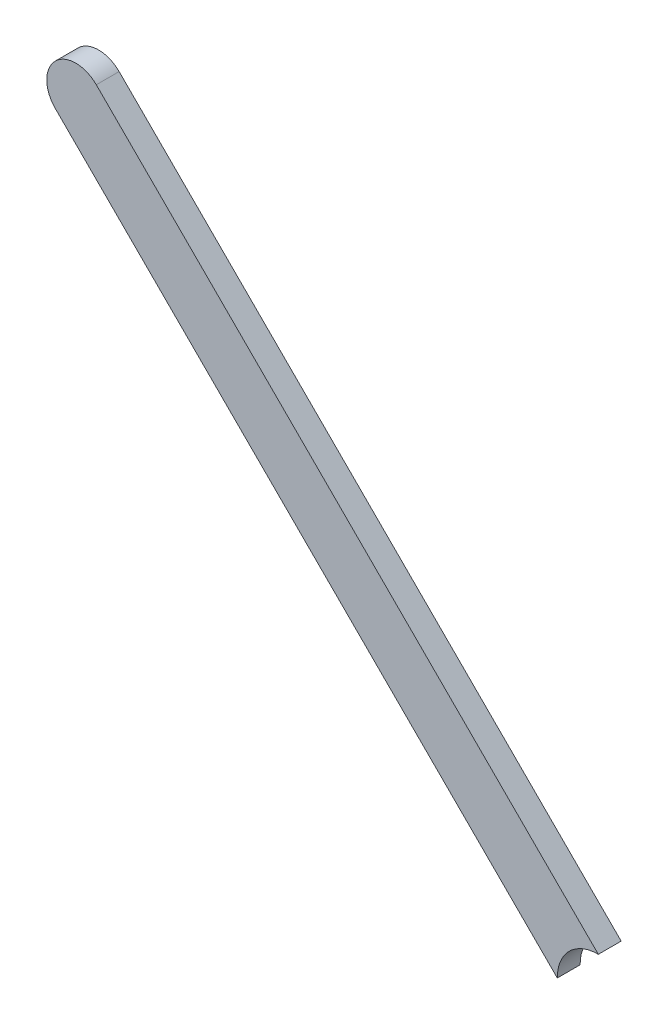
ISO-10303-21;
HEADER;
FILE_DESCRIPTION(('STEP AP214'),'2;1');
FILE_NAME('part.step','',(''),(''),'','','');
FILE_SCHEMA(('AUTOMOTIVE_DESIGN { 1 0 10303 214 1 1 1 1 }'));
ENDSEC;
DATA;
#1=APPLICATION_CONTEXT('core data for automotive mechanical design processes');
#2=APPLICATION_PROTOCOL_DEFINITION('international standard','automotive_design',2000,#1);
#3=PRODUCT_CONTEXT('',#1,'mechanical');
#4=PRODUCT('Part','Part','',(#3));
#5=PRODUCT_RELATED_PRODUCT_CATEGORY('part','',(#4));
#6=PRODUCT_DEFINITION_FORMATION('','',#4);
#7=PRODUCT_DEFINITION_CONTEXT('part definition',#1,'design');
#8=PRODUCT_DEFINITION('design','',#6,#7);
#9=PRODUCT_DEFINITION_SHAPE('','',#8);
#10=(LENGTH_UNIT() NAMED_UNIT(*) SI_UNIT(.MILLI.,.METRE.));
#11=(NAMED_UNIT(*) PLANE_ANGLE_UNIT() SI_UNIT($,.RADIAN.));
#12=(NAMED_UNIT(*) SI_UNIT($,.STERADIAN.) SOLID_ANGLE_UNIT());
#13=UNCERTAINTY_MEASURE_WITH_UNIT(LENGTH_MEASURE(1.E-05),#10,'distance_accuracy_value','');
#14=(GEOMETRIC_REPRESENTATION_CONTEXT(3) GLOBAL_UNCERTAINTY_ASSIGNED_CONTEXT((#13)) GLOBAL_UNIT_ASSIGNED_CONTEXT((#10,
#11,#12)) REPRESENTATION_CONTEXT('',''));
#15=CARTESIAN_POINT('',(0.,0.,0.));
#16=DIRECTION('',(0.,0.,1.));
#17=DIRECTION('',(1.,0.,0.));
#18=AXIS2_PLACEMENT_3D('',#15,#16,#17);
#19=CARTESIAN_POINT('',(104.08739406,78.43339406,0.));
#20=DIRECTION('',(0.707106781186549,0.707106781186546,0.));
#21=DIRECTION('',(0.707106781186546,-0.707106781186549,0.));
#22=AXIS2_PLACEMENT_3D('',#19,#20,#21);
#23=PLANE('',#22);
#24=DIRECTION('',(0.707106781186546,-0.707106781186549,0.));
#25=VECTOR('',#24,1.);
#26=CARTESIAN_POINT('',(104.08739406,78.43339406,0.1999996));
#27=LINE('',#26,#25);
#28=CARTESIAN_POINT('',(104.08739406,78.43339406,0.1999996));
#29=VERTEX_POINT('',#28);
#30=CARTESIAN_POINT('',(108.483418532393,74.0373695876074,0.1999996));
#31=VERTEX_POINT('',#30);
#32=EDGE_CURVE('E11',#29,#31,#27,.T.);
#33=ORIENTED_EDGE('',*,*,#32,.F.);
#34=DIRECTION('',(0.,0.,1.));
#35=VECTOR('',#34,1.);
#36=CARTESIAN_POINT('',(104.08739406,78.43339406,0.));
#37=LINE('',#36,#35);
#38=CARTESIAN_POINT('',(104.08739406,78.43339406,0.));
#39=VERTEX_POINT('',#38);
#40=EDGE_CURVE('E24',#39,#29,#37,.T.);
#41=ORIENTED_EDGE('',*,*,#40,.F.);
#42=DIRECTION('',(0.707106781186546,-0.707106781186549,0.));
#43=VECTOR('',#42,1.);
#44=CARTESIAN_POINT('',(104.08739406,78.43339406,0.));
#45=LINE('',#44,#43);
#46=CARTESIAN_POINT('',(108.483418532393,74.0373695876074,0.));
#47=VERTEX_POINT('',#46);
#48=EDGE_CURVE('E75',#39,#47,#45,.T.);
#49=ORIENTED_EDGE('',*,*,#48,.T.);
#50=DIRECTION('',(0.,0.,1.));
#51=VECTOR('',#50,1.);
#52=CARTESIAN_POINT('',(108.483418532393,74.0373695876074,0.));
#53=LINE('',#52,#51);
#54=EDGE_CURVE('E37',#47,#31,#53,.T.);
#55=ORIENTED_EDGE('',*,*,#54,.T.);
#56=EDGE_LOOP('',(#33,#41,#49,#55));
#57=FACE_BOUND('',#56,.T.);
#58=ADVANCED_FACE('F17',(#57),#23,.F.);
#59=CARTESIAN_POINT('',(108.839,74.041,0.));
#60=DIRECTION('',(0.,0.,-1.));
#61=DIRECTION('',(1.,0.,0.));
#62=AXIS2_PLACEMENT_3D('',#59,#60,#61);
#63=CYLINDRICAL_SURFACE('',#62,0.3556);
#64=DIRECTION('',(0.,0.,1.));
#65=VECTOR('',#64,1.);
#66=CARTESIAN_POINT('',(108.842630412393,74.3965814676074,0.));
#67=LINE('',#66,#65);
#68=CARTESIAN_POINT('',(108.842630412393,74.3965814676074,0.));
#69=VERTEX_POINT('',#68);
#70=CARTESIAN_POINT('',(108.842630412393,74.3965814676074,0.1999996));
#71=VERTEX_POINT('',#70);
#72=EDGE_CURVE('E67',#69,#71,#67,.T.);
#73=ORIENTED_EDGE('',*,*,#72,.T.);
#74=CARTESIAN_POINT('',(108.839,74.041,0.1999996));
#75=DIRECTION('',(0.,0.,1.));
#76=DIRECTION('',(1.,0.,0.));
#77=AXIS2_PLACEMENT_3D('',#74,#75,#76);
#78=CIRCLE('',#77,0.3556);
#79=EDGE_CURVE('E82',#71,#31,#78,.T.);
#80=ORIENTED_EDGE('',*,*,#79,.T.);
#81=ORIENTED_EDGE('',*,*,#54,.F.);
#82=CARTESIAN_POINT('',(108.839,74.041,0.));
#83=DIRECTION('',(0.,0.,1.));
#84=DIRECTION('',(1.,0.,0.));
#85=AXIS2_PLACEMENT_3D('',#82,#83,#84);
#86=CIRCLE('',#85,0.3556);
#87=EDGE_CURVE('E80',#69,#47,#86,.T.);
#88=ORIENTED_EDGE('',*,*,#87,.F.);
#89=EDGE_LOOP('',(#73,#80,#81,#88));
#90=FACE_BOUND('',#89,.T.);
#91=ADVANCED_FACE('F88',(#90),#63,.F.);
#92=CARTESIAN_POINT('',(108.842630412393,74.3965814676074,0.));
#93=DIRECTION('',(-0.707106781186548,-0.707106781186548,0.));
#94=DIRECTION('',(-0.707106781186548,0.707106781186548,0.));
#95=AXIS2_PLACEMENT_3D('',#92,#93,#94);
#96=PLANE('',#95);
#97=DIRECTION('',(-0.707106781186548,0.707106781186548,0.));
#98=VECTOR('',#97,1.);
#99=CARTESIAN_POINT('',(109.01860594,74.22060594,0.1999996));
#100=LINE('',#99,#98);
#101=CARTESIAN_POINT('',(104.44660594,78.79260594,0.1999996));
#102=VERTEX_POINT('',#101);
#103=EDGE_CURVE('E71',#71,#102,#100,.T.);
#104=ORIENTED_EDGE('',*,*,#103,.F.);
#105=ORIENTED_EDGE('',*,*,#72,.F.);
#106=DIRECTION('',(-0.707106781186548,0.707106781186548,0.));
#107=VECTOR('',#106,1.);
#108=CARTESIAN_POINT('',(109.01860594,74.22060594,0.));
#109=LINE('',#108,#107);
#110=CARTESIAN_POINT('',(104.44660594,78.79260594,0.));
#111=VERTEX_POINT('',#110);
#112=EDGE_CURVE('E63',#69,#111,#109,.T.);
#113=ORIENTED_EDGE('',*,*,#112,.T.);
#114=DIRECTION('',(0.,0.,1.));
#115=VECTOR('',#114,1.);
#116=CARTESIAN_POINT('',(104.44660594,78.79260594,0.));
#117=LINE('',#116,#115);
#118=EDGE_CURVE('E53',#111,#102,#117,.T.);
#119=ORIENTED_EDGE('',*,*,#118,.T.);
#120=EDGE_LOOP('',(#104,#105,#113,#119));
#121=FACE_BOUND('',#120,.T.);
#122=ADVANCED_FACE('F66',(#121),#96,.F.);
#123=CARTESIAN_POINT('',(104.267,78.613,0.));
#124=DIRECTION('',(0.,0.,-1.));
#125=DIRECTION('',(0.707106781186576,0.70710678118652,0.));
#126=AXIS2_PLACEMENT_3D('',#123,#124,#125);
#127=CYLINDRICAL_SURFACE('',#126,0.254001156230764);
#128=CARTESIAN_POINT('',(104.267,78.613,0.1999996));
#129=DIRECTION('',(0.,0.,1.));
#130=DIRECTION('',(0.707106781186576,0.70710678118652,0.));
#131=AXIS2_PLACEMENT_3D('',#128,#129,#130);
#132=CIRCLE('',#131,0.254001156230764);
#133=EDGE_CURVE('E59',#102,#29,#132,.T.);
#134=ORIENTED_EDGE('',*,*,#133,.F.);
#135=ORIENTED_EDGE('',*,*,#118,.F.);
#136=CARTESIAN_POINT('',(104.267,78.613,0.));
#137=DIRECTION('',(0.,0.,1.));
#138=DIRECTION('',(0.707106781186576,0.70710678118652,0.));
#139=AXIS2_PLACEMENT_3D('',#136,#137,#138);
#140=CIRCLE('',#139,0.254001156230764);
#141=EDGE_CURVE('E57',#111,#39,#140,.T.);
#142=ORIENTED_EDGE('',*,*,#141,.T.);
#143=ORIENTED_EDGE('',*,*,#40,.T.);
#144=EDGE_LOOP('',(#134,#135,#142,#143));
#145=FACE_BOUND('',#144,.T.);
#146=ADVANCED_FACE('F55',(#145),#127,.T.);
#147=CARTESIAN_POINT('',(104.08739406,78.43339406,0.));
#148=DIRECTION('',(0.,0.,-1.));
#149=DIRECTION('',(-1.,0.,0.));
#150=AXIS2_PLACEMENT_3D('',#147,#148,#149);
#151=PLANE('',#150);
#152=ORIENTED_EDGE('',*,*,#48,.F.);
#153=ORIENTED_EDGE('',*,*,#141,.F.);
#154=ORIENTED_EDGE('',*,*,#112,.F.);
#155=ORIENTED_EDGE('',*,*,#87,.T.);
#156=EDGE_LOOP('',(#152,#153,#154,#155));
#157=FACE_BOUND('',#156,.T.);
#158=ADVANCED_FACE('F74',(#157),#151,.T.);
#159=CARTESIAN_POINT('',(104.08739406,78.43339406,0.1999996));
#160=DIRECTION('',(0.,0.,-1.));
#161=DIRECTION('',(-1.,0.,0.));
#162=AXIS2_PLACEMENT_3D('',#159,#160,#161);
#163=PLANE('',#162);
#164=ORIENTED_EDGE('',*,*,#133,.T.);
#165=ORIENTED_EDGE('',*,*,#32,.T.);
#166=ORIENTED_EDGE('',*,*,#79,.F.);
#167=ORIENTED_EDGE('',*,*,#103,.T.);
#168=EDGE_LOOP('',(#164,#165,#166,#167));
#169=FACE_BOUND('',#168,.T.);
#170=ADVANCED_FACE('F91',(#169),#163,.F.);
#171=CLOSED_SHELL('',(#58,#91,#122,#146,#158,#170));
#172=MANIFOLD_SOLID_BREP('B1',#171);
#173=ADVANCED_BREP_SHAPE_REPRESENTATION('',(#18,#172),#14);
#174=SHAPE_DEFINITION_REPRESENTATION(#9,#173);
ENDSEC;
END-ISO-10303-21;
